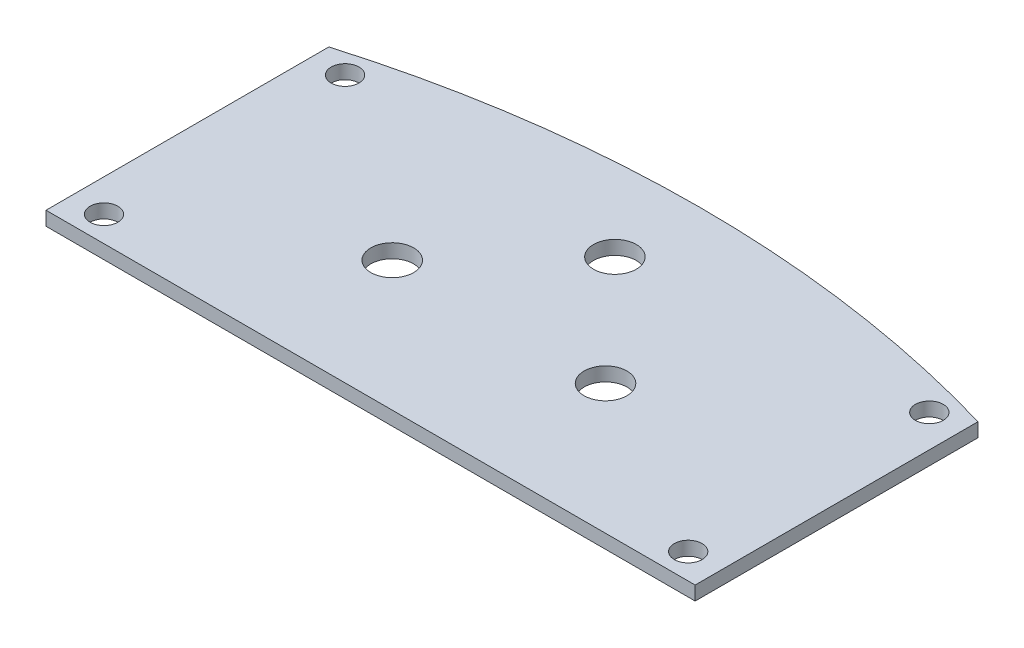
ISO-10303-21;
HEADER;
FILE_DESCRIPTION(('STEP AP214'),'2;1');
FILE_NAME('part.step','',(''),(''),'','','');
FILE_SCHEMA(('AUTOMOTIVE_DESIGN { 1 0 10303 214 1 1 1 1 }'));
ENDSEC;
DATA;
#1=APPLICATION_CONTEXT('core data for automotive mechanical design processes');
#2=APPLICATION_PROTOCOL_DEFINITION('international standard','automotive_design',2000,#1);
#3=PRODUCT_CONTEXT('',#1,'mechanical');
#4=PRODUCT('Part','Part','',(#3));
#5=PRODUCT_RELATED_PRODUCT_CATEGORY('part','',(#4));
#6=PRODUCT_DEFINITION_FORMATION('','',#4);
#7=PRODUCT_DEFINITION_CONTEXT('part definition',#1,'design');
#8=PRODUCT_DEFINITION('design','',#6,#7);
#9=PRODUCT_DEFINITION_SHAPE('','',#8);
#10=(LENGTH_UNIT() NAMED_UNIT(*) SI_UNIT(.MILLI.,.METRE.));
#11=(NAMED_UNIT(*) PLANE_ANGLE_UNIT() SI_UNIT($,.RADIAN.));
#12=(NAMED_UNIT(*) SI_UNIT($,.STERADIAN.) SOLID_ANGLE_UNIT());
#13=UNCERTAINTY_MEASURE_WITH_UNIT(LENGTH_MEASURE(1.E-05),#10,'distance_accuracy_value','');
#14=(GEOMETRIC_REPRESENTATION_CONTEXT(3) GLOBAL_UNCERTAINTY_ASSIGNED_CONTEXT((#13)) GLOBAL_UNIT_ASSIGNED_CONTEXT((#10,
#11,#12)) REPRESENTATION_CONTEXT('',''));
#15=CARTESIAN_POINT('',(0.,0.,0.));
#16=DIRECTION('',(0.,0.,1.));
#17=DIRECTION('',(1.,0.,0.));
#18=AXIS2_PLACEMENT_3D('',#15,#16,#17);
#19=CARTESIAN_POINT('',(0.,3.,210.156596281632));
#20=DIRECTION('',(0.,-1.,0.));
#21=DIRECTION('',(0.,0.,-1.));
#22=AXIS2_PLACEMENT_3D('',#19,#20,#21);
#23=CYLINDRICAL_SURFACE('',#22,248.710616879806);
#24=CARTESIAN_POINT('',(0.,0.,210.156596281632));
#25=DIRECTION('',(0.,1.,0.));
#26=DIRECTION('',(0.,0.,-1.));
#27=AXIS2_PLACEMENT_3D('',#24,#25,#26);
#28=CIRCLE('',#27,248.710616879806);
#29=CARTESIAN_POINT('',(70.,0.,-28.5));
#30=VERTEX_POINT('',#29);
#31=CARTESIAN_POINT('',(-70.,0.,-28.5));
#32=VERTEX_POINT('',#31);
#33=EDGE_CURVE('E111',#30,#32,#28,.T.);
#34=ORIENTED_EDGE('',*,*,#33,.T.);
#35=DIRECTION('',(0.,-1.,0.));
#36=VECTOR('',#35,1.);
#37=CARTESIAN_POINT('',(-70.,3.,-28.5));
#38=LINE('',#37,#36);
#39=CARTESIAN_POINT('',(-70.,3.,-28.5));
#40=VERTEX_POINT('',#39);
#41=EDGE_CURVE('E11',#40,#32,#38,.T.);
#42=ORIENTED_EDGE('',*,*,#41,.F.);
#43=CARTESIAN_POINT('',(0.,3.,210.156596281632));
#44=DIRECTION('',(0.,1.,0.));
#45=DIRECTION('',(0.,0.,-1.));
#46=AXIS2_PLACEMENT_3D('',#43,#44,#45);
#47=CIRCLE('',#46,248.710616879806);
#48=CARTESIAN_POINT('',(70.,3.,-28.5));
#49=VERTEX_POINT('',#48);
#50=EDGE_CURVE('E94',#49,#40,#47,.T.);
#51=ORIENTED_EDGE('',*,*,#50,.F.);
#52=DIRECTION('',(0.,-1.,0.));
#53=VECTOR('',#52,1.);
#54=CARTESIAN_POINT('',(70.,3.,-28.5));
#55=LINE('',#54,#53);
#56=EDGE_CURVE('E107',#49,#30,#55,.T.);
#57=ORIENTED_EDGE('',*,*,#56,.T.);
#58=EDGE_LOOP('',(#34,#42,#51,#57));
#59=FACE_BOUND('',#58,.T.);
#60=ADVANCED_FACE('F40',(#59),#23,.T.);
#61=CARTESIAN_POINT('',(-70.,3.,32.5));
#62=DIRECTION('',(1.,0.,0.));
#63=DIRECTION('',(0.,0.,-1.));
#64=AXIS2_PLACEMENT_3D('',#61,#62,#63);
#65=PLANE('',#64);
#66=DIRECTION('',(0.,0.,1.));
#67=VECTOR('',#66,1.);
#68=CARTESIAN_POINT('',(-70.,0.,32.5));
#69=LINE('',#68,#67);
#70=CARTESIAN_POINT('',(-70.,0.,32.5));
#71=VERTEX_POINT('',#70);
#72=EDGE_CURVE('E99',#32,#71,#69,.T.);
#73=ORIENTED_EDGE('',*,*,#72,.T.);
#74=DIRECTION('',(0.,-1.,0.));
#75=VECTOR('',#74,1.);
#76=CARTESIAN_POINT('',(-70.,3.,32.5));
#77=LINE('',#76,#75);
#78=CARTESIAN_POINT('',(-70.,3.,32.5));
#79=VERTEX_POINT('',#78);
#80=EDGE_CURVE('E50',#79,#71,#77,.T.);
#81=ORIENTED_EDGE('',*,*,#80,.F.);
#82=DIRECTION('',(0.,0.,1.));
#83=VECTOR('',#82,1.);
#84=CARTESIAN_POINT('',(-70.,3.,32.5));
#85=LINE('',#84,#83);
#86=EDGE_CURVE('E89',#40,#79,#85,.T.);
#87=ORIENTED_EDGE('',*,*,#86,.F.);
#88=ORIENTED_EDGE('',*,*,#41,.T.);
#89=EDGE_LOOP('',(#73,#81,#87,#88));
#90=FACE_BOUND('',#89,.T.);
#91=ADVANCED_FACE('F98',(#90),#65,.F.);
#92=CARTESIAN_POINT('',(-70.,3.,32.5));
#93=DIRECTION('',(0.,0.,-1.));
#94=DIRECTION('',(-1.,0.,0.));
#95=AXIS2_PLACEMENT_3D('',#92,#93,#94);
#96=PLANE('',#95);
#97=DIRECTION('',(1.,0.,0.));
#98=VECTOR('',#97,1.);
#99=CARTESIAN_POINT('',(-70.,0.,32.5));
#100=LINE('',#99,#98);
#101=CARTESIAN_POINT('',(70.,0.,32.5));
#102=VERTEX_POINT('',#101);
#103=EDGE_CURVE('E76',#71,#102,#100,.T.);
#104=ORIENTED_EDGE('',*,*,#103,.T.);
#105=DIRECTION('',(0.,-1.,0.));
#106=VECTOR('',#105,1.);
#107=CARTESIAN_POINT('',(70.,3.,32.5));
#108=LINE('',#107,#106);
#109=CARTESIAN_POINT('',(70.,3.,32.5));
#110=VERTEX_POINT('',#109);
#111=EDGE_CURVE('E101',#110,#102,#108,.T.);
#112=ORIENTED_EDGE('',*,*,#111,.F.);
#113=DIRECTION('',(1.,0.,0.));
#114=VECTOR('',#113,1.);
#115=CARTESIAN_POINT('',(-70.,3.,32.5));
#116=LINE('',#115,#114);
#117=EDGE_CURVE('E92',#79,#110,#116,.T.);
#118=ORIENTED_EDGE('',*,*,#117,.F.);
#119=ORIENTED_EDGE('',*,*,#80,.T.);
#120=EDGE_LOOP('',(#104,#112,#118,#119));
#121=FACE_BOUND('',#120,.T.);
#122=ADVANCED_FACE('F103',(#121),#96,.F.);
#123=CARTESIAN_POINT('',(70.,3.,-28.5));
#124=DIRECTION('',(-1.,0.,0.));
#125=DIRECTION('',(0.,0.,1.));
#126=AXIS2_PLACEMENT_3D('',#123,#124,#125);
#127=PLANE('',#126);
#128=DIRECTION('',(0.,0.,-1.));
#129=VECTOR('',#128,1.);
#130=CARTESIAN_POINT('',(70.,0.,-28.5));
#131=LINE('',#130,#129);
#132=EDGE_CURVE('E82',#102,#30,#131,.T.);
#133=ORIENTED_EDGE('',*,*,#132,.T.);
#134=ORIENTED_EDGE('',*,*,#56,.F.);
#135=DIRECTION('',(0.,0.,-1.));
#136=VECTOR('',#135,1.);
#137=CARTESIAN_POINT('',(70.,3.,-28.5));
#138=LINE('',#137,#136);
#139=EDGE_CURVE('E59',#110,#49,#138,.T.);
#140=ORIENTED_EDGE('',*,*,#139,.F.);
#141=ORIENTED_EDGE('',*,*,#111,.T.);
#142=EDGE_LOOP('',(#133,#134,#140,#141));
#143=FACE_BOUND('',#142,.T.);
#144=ADVANCED_FACE('F158',(#143),#127,.F.);
#145=CARTESIAN_POINT('',(0.,3.,210.156596281632));
#146=DIRECTION('',(0.,-1.,0.));
#147=DIRECTION('',(0.,0.,-1.));
#148=AXIS2_PLACEMENT_3D('',#145,#146,#147);
#149=PLANE('',#148);
#150=CARTESIAN_POINT('',(-23.33,3.,4.50000000000001));
#151=DIRECTION('',(0.,-1.,0.));
#152=DIRECTION('',(0.,0.,-1.));
#153=AXIS2_PLACEMENT_3D('',#150,#151,#152);
#154=CIRCLE('',#153,4.62);
#155=CARTESIAN_POINT('',(-23.33,3.,-0.119999999999988));
#156=VERTEX_POINT('',#155);
#157=EDGE_CURVE('E266',#156,#156,#154,.T.);
#158=ORIENTED_EDGE('',*,*,#157,.T.);
#159=EDGE_LOOP('',(#158));
#160=FACE_BOUND('',#159,.T.);
#161=CARTESIAN_POINT('',(22.67,3.,4.50000000000001));
#162=DIRECTION('',(0.,-1.,0.));
#163=DIRECTION('',(0.,0.,-1.));
#164=AXIS2_PLACEMENT_3D('',#161,#162,#163);
#165=CIRCLE('',#164,4.62);
#166=CARTESIAN_POINT('',(22.67,3.,-0.119999999999992));
#167=VERTEX_POINT('',#166);
#168=EDGE_CURVE('E269',#167,#167,#165,.T.);
#169=ORIENTED_EDGE('',*,*,#168,.T.);
#170=EDGE_LOOP('',(#169));
#171=FACE_BOUND('',#170,.T.);
#172=CARTESIAN_POINT('',(0.0559912362506527,3.,-20.1385128183096));
#173=DIRECTION('',(0.,-1.,0.));
#174=DIRECTION('',(0.,0.,-1.));
#175=AXIS2_PLACEMENT_3D('',#172,#173,#174);
#176=CIRCLE('',#175,4.62);
#177=CARTESIAN_POINT('',(0.0559912362506527,3.,-24.7585128183096));
#178=VERTEX_POINT('',#177);
#179=EDGE_CURVE('E277',#178,#178,#176,.T.);
#180=ORIENTED_EDGE('',*,*,#179,.T.);
#181=EDGE_LOOP('',(#180));
#182=FACE_BOUND('',#181,.T.);
#183=CARTESIAN_POINT('',(-63.,3.,27.));
#184=DIRECTION('',(0.,1.,0.));
#185=DIRECTION('',(0.,0.,1.));
#186=AXIS2_PLACEMENT_3D('',#183,#184,#185);
#187=CIRCLE('',#186,3.);
#188=CARTESIAN_POINT('',(-63.,3.,30.));
#189=VERTEX_POINT('',#188);
#190=EDGE_CURVE('E281',#189,#189,#187,.T.);
#191=ORIENTED_EDGE('',*,*,#190,.F.);
#192=EDGE_LOOP('',(#191));
#193=FACE_BOUND('',#192,.T.);
#194=CARTESIAN_POINT('',(63.,3.,-25.));
#195=DIRECTION('',(0.,1.,0.));
#196=DIRECTION('',(0.,0.,1.));
#197=AXIS2_PLACEMENT_3D('',#194,#195,#196);
#198=CIRCLE('',#197,3.00000000000001);
#199=CARTESIAN_POINT('',(63.,3.,-22.));
#200=VERTEX_POINT('',#199);
#201=EDGE_CURVE('E274',#200,#200,#198,.T.);
#202=ORIENTED_EDGE('',*,*,#201,.F.);
#203=EDGE_LOOP('',(#202));
#204=FACE_BOUND('',#203,.T.);
#205=CARTESIAN_POINT('',(63.,3.,27.));
#206=DIRECTION('',(0.,1.,0.));
#207=DIRECTION('',(0.,0.,1.));
#208=AXIS2_PLACEMENT_3D('',#205,#206,#207);
#209=CIRCLE('',#208,3.00000000000001);
#210=CARTESIAN_POINT('',(63.,3.,30.));
#211=VERTEX_POINT('',#210);
#212=EDGE_CURVE('E268',#211,#211,#209,.T.);
#213=ORIENTED_EDGE('',*,*,#212,.F.);
#214=EDGE_LOOP('',(#213));
#215=FACE_BOUND('',#214,.T.);
#216=CARTESIAN_POINT('',(-63.,3.,-25.));
#217=DIRECTION('',(0.,1.,0.));
#218=DIRECTION('',(0.,0.,1.));
#219=AXIS2_PLACEMENT_3D('',#216,#217,#218);
#220=CIRCLE('',#219,3.);
#221=CARTESIAN_POINT('',(-63.,3.,-22.));
#222=VERTEX_POINT('',#221);
#223=EDGE_CURVE('E130',#222,#222,#220,.T.);
#224=ORIENTED_EDGE('',*,*,#223,.F.);
#225=EDGE_LOOP('',(#224));
#226=FACE_BOUND('',#225,.T.);
#227=ORIENTED_EDGE('',*,*,#50,.T.);
#228=ORIENTED_EDGE('',*,*,#86,.T.);
#229=ORIENTED_EDGE('',*,*,#117,.T.);
#230=ORIENTED_EDGE('',*,*,#139,.T.);
#231=EDGE_LOOP('',(#227,#228,#229,#230));
#232=FACE_BOUND('',#231,.T.);
#233=ADVANCED_FACE('F90',(#160,#171,#182,#193,#204,#215,#226,#232),#149,.F.);
#234=CARTESIAN_POINT('',(0.,0.,210.156596281632));
#235=DIRECTION('',(0.,-1.,0.));
#236=DIRECTION('',(0.,0.,-1.));
#237=AXIS2_PLACEMENT_3D('',#234,#235,#236);
#238=PLANE('',#237);
#239=CARTESIAN_POINT('',(-23.33,0.,4.50000000000001));
#240=DIRECTION('',(0.,-1.,0.));
#241=DIRECTION('',(0.,0.,-1.));
#242=AXIS2_PLACEMENT_3D('',#239,#240,#241);
#243=CIRCLE('',#242,4.62);
#244=CARTESIAN_POINT('',(-23.33,0.,-0.119999999999988));
#245=VERTEX_POINT('',#244);
#246=EDGE_CURVE('E263',#245,#245,#243,.T.);
#247=ORIENTED_EDGE('',*,*,#246,.F.);
#248=EDGE_LOOP('',(#247));
#249=FACE_BOUND('',#248,.T.);
#250=CARTESIAN_POINT('',(22.67,0.,4.50000000000001));
#251=DIRECTION('',(0.,-1.,0.));
#252=DIRECTION('',(0.,0.,-1.));
#253=AXIS2_PLACEMENT_3D('',#250,#251,#252);
#254=CIRCLE('',#253,4.62);
#255=CARTESIAN_POINT('',(22.67,0.,-0.119999999999992));
#256=VERTEX_POINT('',#255);
#257=EDGE_CURVE('E309',#256,#256,#254,.T.);
#258=ORIENTED_EDGE('',*,*,#257,.F.);
#259=EDGE_LOOP('',(#258));
#260=FACE_BOUND('',#259,.T.);
#261=CARTESIAN_POINT('',(0.0559912362506527,0.,-20.1385128183096));
#262=DIRECTION('',(0.,-1.,0.));
#263=DIRECTION('',(0.,0.,-1.));
#264=AXIS2_PLACEMENT_3D('',#261,#262,#263);
#265=CIRCLE('',#264,4.62);
#266=CARTESIAN_POINT('',(0.0559912362506527,0.,-24.7585128183096));
#267=VERTEX_POINT('',#266);
#268=EDGE_CURVE('E305',#267,#267,#265,.T.);
#269=ORIENTED_EDGE('',*,*,#268,.F.);
#270=EDGE_LOOP('',(#269));
#271=FACE_BOUND('',#270,.T.);
#272=CARTESIAN_POINT('',(-63.,0.,27.));
#273=DIRECTION('',(0.,-1.,0.));
#274=DIRECTION('',(0.,0.,-1.));
#275=AXIS2_PLACEMENT_3D('',#272,#273,#274);
#276=CIRCLE('',#275,3.);
#277=CARTESIAN_POINT('',(-63.,0.,24.));
#278=VERTEX_POINT('',#277);
#279=EDGE_CURVE('E43',#278,#278,#276,.T.);
#280=ORIENTED_EDGE('',*,*,#279,.F.);
#281=EDGE_LOOP('',(#280));
#282=FACE_BOUND('',#281,.T.);
#283=CARTESIAN_POINT('',(63.,0.,-25.));
#284=DIRECTION('',(0.,-1.,0.));
#285=DIRECTION('',(0.,0.,-1.));
#286=AXIS2_PLACEMENT_3D('',#283,#284,#285);
#287=CIRCLE('',#286,3.00000000000001);
#288=CARTESIAN_POINT('',(63.,0.,-28.));
#289=VERTEX_POINT('',#288);
#290=EDGE_CURVE('E133',#289,#289,#287,.T.);
#291=ORIENTED_EDGE('',*,*,#290,.F.);
#292=EDGE_LOOP('',(#291));
#293=FACE_BOUND('',#292,.T.);
#294=CARTESIAN_POINT('',(63.,0.,27.));
#295=DIRECTION('',(0.,-1.,0.));
#296=DIRECTION('',(0.,0.,-1.));
#297=AXIS2_PLACEMENT_3D('',#294,#295,#296);
#298=CIRCLE('',#297,3.00000000000001);
#299=CARTESIAN_POINT('',(63.,0.,24.));
#300=VERTEX_POINT('',#299);
#301=EDGE_CURVE('E129',#300,#300,#298,.T.);
#302=ORIENTED_EDGE('',*,*,#301,.F.);
#303=EDGE_LOOP('',(#302));
#304=FACE_BOUND('',#303,.T.);
#305=CARTESIAN_POINT('',(-63.,0.,-25.));
#306=DIRECTION('',(0.,-1.,0.));
#307=DIRECTION('',(0.,0.,-1.));
#308=AXIS2_PLACEMENT_3D('',#305,#306,#307);
#309=CIRCLE('',#308,3.);
#310=CARTESIAN_POINT('',(-63.,0.,-28.));
#311=VERTEX_POINT('',#310);
#312=EDGE_CURVE('E125',#311,#311,#309,.T.);
#313=ORIENTED_EDGE('',*,*,#312,.F.);
#314=EDGE_LOOP('',(#313));
#315=FACE_BOUND('',#314,.T.);
#316=ORIENTED_EDGE('',*,*,#33,.F.);
#317=ORIENTED_EDGE('',*,*,#132,.F.);
#318=ORIENTED_EDGE('',*,*,#103,.F.);
#319=ORIENTED_EDGE('',*,*,#72,.F.);
#320=EDGE_LOOP('',(#316,#317,#318,#319));
#321=FACE_BOUND('',#320,.T.);
#322=ADVANCED_FACE('F145',(#249,#260,#271,#282,#293,#304,#315,#321),#238,.T.);
#323=CARTESIAN_POINT('',(-63.,-7.,-25.));
#324=DIRECTION('',(0.,1.,0.));
#325=DIRECTION('',(0.,0.,1.));
#326=AXIS2_PLACEMENT_3D('',#323,#324,#325);
#327=CYLINDRICAL_SURFACE('',#326,3.);
#328=ORIENTED_EDGE('',*,*,#312,.T.);
#329=EDGE_LOOP('',(#328));
#330=FACE_BOUND('',#329,.T.);
#331=ORIENTED_EDGE('',*,*,#223,.T.);
#332=EDGE_LOOP('',(#331));
#333=FACE_BOUND('',#332,.T.);
#334=ADVANCED_FACE('F148',(#330,#333),#327,.F.);
#335=CARTESIAN_POINT('',(63.,-7.,27.));
#336=DIRECTION('',(0.,1.,0.));
#337=DIRECTION('',(0.,0.,1.));
#338=AXIS2_PLACEMENT_3D('',#335,#336,#337);
#339=CYLINDRICAL_SURFACE('',#338,3.00000000000001);
#340=ORIENTED_EDGE('',*,*,#301,.T.);
#341=EDGE_LOOP('',(#340));
#342=FACE_BOUND('',#341,.T.);
#343=ORIENTED_EDGE('',*,*,#212,.T.);
#344=EDGE_LOOP('',(#343));
#345=FACE_BOUND('',#344,.T.);
#346=ADVANCED_FACE('F193',(#342,#345),#339,.F.);
#347=CARTESIAN_POINT('',(63.,-7.,-25.));
#348=DIRECTION('',(0.,1.,0.));
#349=DIRECTION('',(0.,0.,1.));
#350=AXIS2_PLACEMENT_3D('',#347,#348,#349);
#351=CYLINDRICAL_SURFACE('',#350,3.00000000000001);
#352=ORIENTED_EDGE('',*,*,#290,.T.);
#353=EDGE_LOOP('',(#352));
#354=FACE_BOUND('',#353,.T.);
#355=ORIENTED_EDGE('',*,*,#201,.T.);
#356=EDGE_LOOP('',(#355));
#357=FACE_BOUND('',#356,.T.);
#358=ADVANCED_FACE('F205',(#354,#357),#351,.F.);
#359=CARTESIAN_POINT('',(-63.,-7.,27.));
#360=DIRECTION('',(0.,1.,0.));
#361=DIRECTION('',(0.,0.,1.));
#362=AXIS2_PLACEMENT_3D('',#359,#360,#361);
#363=CYLINDRICAL_SURFACE('',#362,3.);
#364=ORIENTED_EDGE('',*,*,#279,.T.);
#365=EDGE_LOOP('',(#364));
#366=FACE_BOUND('',#365,.T.);
#367=ORIENTED_EDGE('',*,*,#190,.T.);
#368=EDGE_LOOP('',(#367));
#369=FACE_BOUND('',#368,.T.);
#370=ADVANCED_FACE('F142',(#366,#369),#363,.F.);
#371=CARTESIAN_POINT('',(0.0559912362506527,10.,-20.1385128183096));
#372=DIRECTION('',(0.,-1.,0.));
#373=DIRECTION('',(0.,0.,-1.));
#374=AXIS2_PLACEMENT_3D('',#371,#372,#373);
#375=CYLINDRICAL_SURFACE('',#374,4.62);
#376=ORIENTED_EDGE('',*,*,#268,.T.);
#377=EDGE_LOOP('',(#376));
#378=FACE_BOUND('',#377,.T.);
#379=ORIENTED_EDGE('',*,*,#179,.F.);
#380=EDGE_LOOP('',(#379));
#381=FACE_BOUND('',#380,.T.);
#382=ADVANCED_FACE('F222',(#378,#381),#375,.F.);
#383=CARTESIAN_POINT('',(22.67,10.,4.50000000000001));
#384=DIRECTION('',(0.,-1.,0.));
#385=DIRECTION('',(0.,0.,-1.));
#386=AXIS2_PLACEMENT_3D('',#383,#384,#385);
#387=CYLINDRICAL_SURFACE('',#386,4.62);
#388=ORIENTED_EDGE('',*,*,#257,.T.);
#389=EDGE_LOOP('',(#388));
#390=FACE_BOUND('',#389,.T.);
#391=ORIENTED_EDGE('',*,*,#168,.F.);
#392=EDGE_LOOP('',(#391));
#393=FACE_BOUND('',#392,.T.);
#394=ADVANCED_FACE('F236',(#390,#393),#387,.F.);
#395=CARTESIAN_POINT('',(-23.33,10.,4.50000000000001));
#396=DIRECTION('',(0.,-1.,0.));
#397=DIRECTION('',(0.,0.,-1.));
#398=AXIS2_PLACEMENT_3D('',#395,#396,#397);
#399=CYLINDRICAL_SURFACE('',#398,4.62);
#400=ORIENTED_EDGE('',*,*,#246,.T.);
#401=EDGE_LOOP('',(#400));
#402=FACE_BOUND('',#401,.T.);
#403=ORIENTED_EDGE('',*,*,#157,.F.);
#404=EDGE_LOOP('',(#403));
#405=FACE_BOUND('',#404,.T.);
#406=ADVANCED_FACE('F246',(#402,#405),#399,.F.);
#407=CLOSED_SHELL('',(#60,#91,#122,#144,#233,#322,#334,#346,#358,#370,#382,#394,#406));
#408=MANIFOLD_SOLID_BREP('B2',#407);
#409=ADVANCED_BREP_SHAPE_REPRESENTATION('',(#18,#408),#14);
#410=SHAPE_DEFINITION_REPRESENTATION(#9,#409);
ENDSEC;
END-ISO-10303-21;
